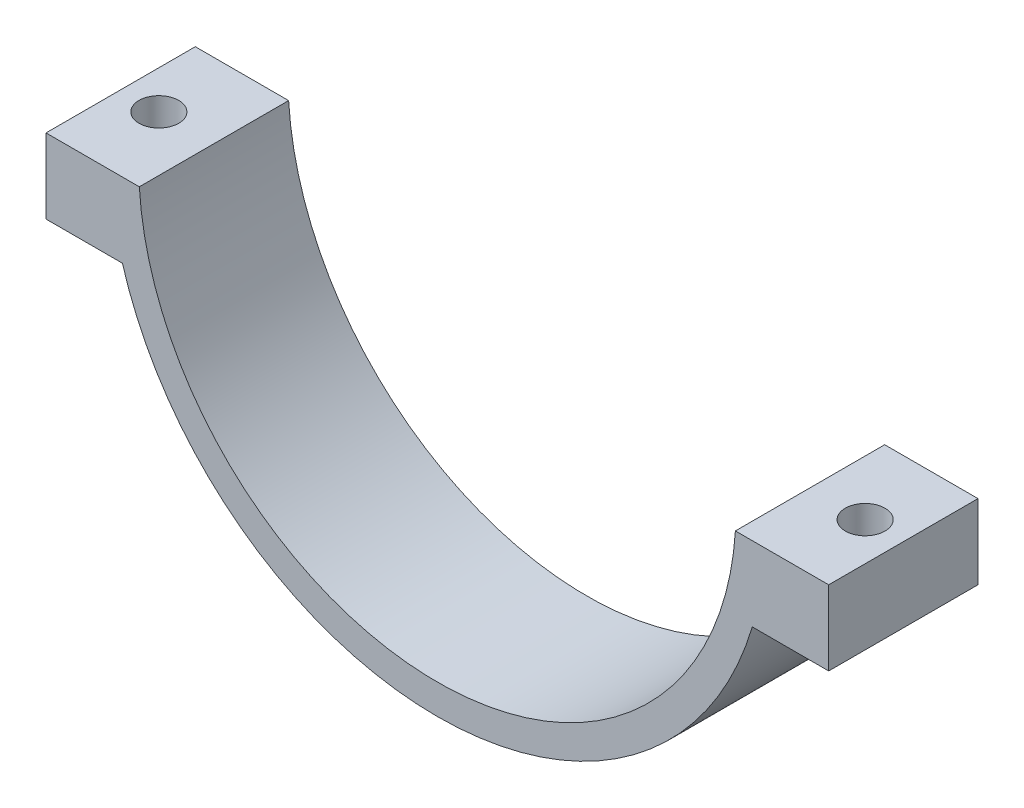
ISO-10303-21;
HEADER;
FILE_DESCRIPTION(('STEP AP214'),'2;1');
FILE_NAME('part.step','',(''),(''),'','','');
FILE_SCHEMA(('AUTOMOTIVE_DESIGN { 1 0 10303 214 1 1 1 1 }'));
ENDSEC;
DATA;
#1=APPLICATION_CONTEXT('core data for automotive mechanical design processes');
#2=APPLICATION_PROTOCOL_DEFINITION('international standard','automotive_design',2000,#1);
#3=PRODUCT_CONTEXT('',#1,'mechanical');
#4=PRODUCT('Part','Part','',(#3));
#5=PRODUCT_RELATED_PRODUCT_CATEGORY('part','',(#4));
#6=PRODUCT_DEFINITION_FORMATION('','',#4);
#7=PRODUCT_DEFINITION_CONTEXT('part definition',#1,'design');
#8=PRODUCT_DEFINITION('design','',#6,#7);
#9=PRODUCT_DEFINITION_SHAPE('','',#8);
#10=(LENGTH_UNIT() NAMED_UNIT(*) SI_UNIT(.MILLI.,.METRE.));
#11=(NAMED_UNIT(*) PLANE_ANGLE_UNIT() SI_UNIT($,.RADIAN.));
#12=(NAMED_UNIT(*) SI_UNIT($,.STERADIAN.) SOLID_ANGLE_UNIT());
#13=UNCERTAINTY_MEASURE_WITH_UNIT(LENGTH_MEASURE(1.E-05),#10,'distance_accuracy_value','');
#14=(GEOMETRIC_REPRESENTATION_CONTEXT(3) GLOBAL_UNCERTAINTY_ASSIGNED_CONTEXT((#13)) GLOBAL_UNIT_ASSIGNED_CONTEXT((#10,
#11,#12)) REPRESENTATION_CONTEXT('',''));
#15=CARTESIAN_POINT('',(0.,0.,0.));
#16=DIRECTION('',(0.,0.,1.));
#17=DIRECTION('',(1.,0.,0.));
#18=AXIS2_PLACEMENT_3D('',#15,#16,#17);
#19=CARTESIAN_POINT('',(0.,50.8,12.7));
#20=DIRECTION('',(0.,0.,-1.));
#21=DIRECTION('',(-1.,0.,0.));
#22=AXIS2_PLACEMENT_3D('',#19,#20,#21);
#23=CYLINDRICAL_SURFACE('',#22,50.8);
#24=CARTESIAN_POINT('',(0.,50.8,-12.7));
#25=DIRECTION('',(0.,0.,-1.));
#26=DIRECTION('',(1.,0.,0.));
#27=AXIS2_PLACEMENT_3D('',#24,#25,#26);
#28=CIRCLE('',#27,50.8);
#29=CARTESIAN_POINT('',(50.7006841669814,47.625,-12.7));
#30=VERTEX_POINT('',#29);
#31=CARTESIAN_POINT('',(-50.7006841669814,47.625,-12.7));
#32=VERTEX_POINT('',#31);
#33=EDGE_CURVE('E144',#30,#32,#28,.T.);
#34=ORIENTED_EDGE('',*,*,#33,.T.);
#35=DIRECTION('',(0.,0.,-1.));
#36=VECTOR('',#35,1.);
#37=CARTESIAN_POINT('',(-50.7006841669814,47.625,12.7));
#38=LINE('',#37,#36);
#39=CARTESIAN_POINT('',(-50.7006841669814,47.625,12.7));
#40=VERTEX_POINT('',#39);
#41=EDGE_CURVE('E11',#40,#32,#38,.T.);
#42=ORIENTED_EDGE('',*,*,#41,.F.);
#43=CARTESIAN_POINT('',(0.,50.8,12.7));
#44=DIRECTION('',(0.,0.,-1.));
#45=DIRECTION('',(1.,0.,0.));
#46=AXIS2_PLACEMENT_3D('',#43,#44,#45);
#47=CIRCLE('',#46,50.8);
#48=CARTESIAN_POINT('',(50.7006841669814,47.625,12.7));
#49=VERTEX_POINT('',#48);
#50=EDGE_CURVE('E167',#49,#40,#47,.T.);
#51=ORIENTED_EDGE('',*,*,#50,.F.);
#52=DIRECTION('',(0.,0.,-1.));
#53=VECTOR('',#52,1.);
#54=CARTESIAN_POINT('',(50.7006841669814,47.625,12.7));
#55=LINE('',#54,#53);
#56=EDGE_CURVE('E140',#49,#30,#55,.T.);
#57=ORIENTED_EDGE('',*,*,#56,.T.);
#58=EDGE_LOOP('',(#34,#42,#51,#57));
#59=FACE_BOUND('',#58,.T.);
#60=ADVANCED_FACE('F43',(#59),#23,.F.);
#61=CARTESIAN_POINT('',(-50.7006841669814,47.625,12.7));
#62=DIRECTION('',(0.,-1.,0.));
#63=DIRECTION('',(1.,0.,0.));
#64=AXIS2_PLACEMENT_3D('',#61,#62,#63);
#65=PLANE('',#64);
#66=CARTESIAN_POINT('',(-60.0766399988508,47.625,0.));
#67=DIRECTION('',(0.,-1.,0.));
#68=DIRECTION('',(0.,0.,-1.));
#69=AXIS2_PLACEMENT_3D('',#66,#67,#68);
#70=CIRCLE('',#69,3.3782);
#71=CARTESIAN_POINT('',(-60.0766399988508,47.625,-3.3782));
#72=VERTEX_POINT('',#71);
#73=EDGE_CURVE('E222',#72,#72,#70,.T.);
#74=ORIENTED_EDGE('',*,*,#73,.T.);
#75=EDGE_LOOP('',(#74));
#76=FACE_BOUND('',#75,.T.);
#77=DIRECTION('',(-1.,0.,0.));
#78=VECTOR('',#77,1.);
#79=CARTESIAN_POINT('',(-50.7006841669814,47.625,-12.7));
#80=LINE('',#79,#78);
#81=CARTESIAN_POINT('',(-66.5756841669814,47.625,-12.7));
#82=VERTEX_POINT('',#81);
#83=EDGE_CURVE('E148',#32,#82,#80,.T.);
#84=ORIENTED_EDGE('',*,*,#83,.T.);
#85=DIRECTION('',(0.,0.,-1.));
#86=VECTOR('',#85,1.);
#87=CARTESIAN_POINT('',(-66.5756841669814,47.625,12.7));
#88=LINE('',#87,#86);
#89=CARTESIAN_POINT('',(-66.5756841669814,47.625,12.7));
#90=VERTEX_POINT('',#89);
#91=EDGE_CURVE('E52',#90,#82,#88,.T.);
#92=ORIENTED_EDGE('',*,*,#91,.F.);
#93=DIRECTION('',(-1.,0.,0.));
#94=VECTOR('',#93,1.);
#95=CARTESIAN_POINT('',(-50.7006841669814,47.625,12.7));
#96=LINE('',#95,#94);
#97=EDGE_CURVE('E103',#40,#90,#96,.T.);
#98=ORIENTED_EDGE('',*,*,#97,.F.);
#99=ORIENTED_EDGE('',*,*,#41,.T.);
#100=EDGE_LOOP('',(#84,#92,#98,#99));
#101=FACE_BOUND('',#100,.T.);
#102=ADVANCED_FACE('F244',(#76,#101),#65,.F.);
#103=CARTESIAN_POINT('',(-66.5756841669814,47.625,12.7));
#104=DIRECTION('',(1.,0.,0.));
#105=DIRECTION('',(0.,0.,-1.));
#106=AXIS2_PLACEMENT_3D('',#103,#104,#105);
#107=PLANE('',#106);
#108=DIRECTION('',(0.,-1.,0.));
#109=VECTOR('',#108,1.);
#110=CARTESIAN_POINT('',(-66.5756841669814,47.625,-12.7));
#111=LINE('',#110,#109);
#112=CARTESIAN_POINT('',(-66.5756841669814,34.925,-12.7));
#113=VERTEX_POINT('',#112);
#114=EDGE_CURVE('E152',#82,#113,#111,.T.);
#115=ORIENTED_EDGE('',*,*,#114,.T.);
#116=DIRECTION('',(0.,0.,-1.));
#117=VECTOR('',#116,1.);
#118=CARTESIAN_POINT('',(-66.5756841669814,34.925,12.7));
#119=LINE('',#118,#117);
#120=CARTESIAN_POINT('',(-66.5756841669814,34.925,12.7));
#121=VERTEX_POINT('',#120);
#122=EDGE_CURVE('E178',#121,#113,#119,.T.);
#123=ORIENTED_EDGE('',*,*,#122,.F.);
#124=DIRECTION('',(0.,-1.,0.));
#125=VECTOR('',#124,1.);
#126=CARTESIAN_POINT('',(-66.5756841669814,47.625,12.7));
#127=LINE('',#126,#125);
#128=EDGE_CURVE('E188',#90,#121,#127,.T.);
#129=ORIENTED_EDGE('',*,*,#128,.F.);
#130=ORIENTED_EDGE('',*,*,#91,.T.);
#131=EDGE_LOOP('',(#115,#123,#129,#130));
#132=FACE_BOUND('',#131,.T.);
#133=ADVANCED_FACE('F186',(#132),#107,.F.);
#134=CARTESIAN_POINT('',(-66.5756841669814,34.925,12.7));
#135=DIRECTION('',(0.,1.,0.));
#136=DIRECTION('',(0.,0.,1.));
#137=AXIS2_PLACEMENT_3D('',#134,#135,#136);
#138=PLANE('',#137);
#139=CARTESIAN_POINT('',(-60.0766399988508,34.925,0.));
#140=DIRECTION('',(0.,-1.,0.));
#141=DIRECTION('',(0.,0.,-1.));
#142=AXIS2_PLACEMENT_3D('',#139,#140,#141);
#143=CIRCLE('',#142,4.0132);
#144=CARTESIAN_POINT('',(-60.0766399988508,34.925,-4.0132));
#145=VERTEX_POINT('',#144);
#146=EDGE_CURVE('E230',#145,#145,#143,.T.);
#147=ORIENTED_EDGE('',*,*,#146,.F.);
#148=EDGE_LOOP('',(#147));
#149=FACE_BOUND('',#148,.T.);
#150=DIRECTION('',(1.,0.,0.));
#151=VECTOR('',#150,1.);
#152=CARTESIAN_POINT('',(-66.5756841669814,34.925,-12.7));
#153=LINE('',#152,#151);
#154=CARTESIAN_POINT('',(-53.5775958307201,34.925,-12.7));
#155=VERTEX_POINT('',#154);
#156=EDGE_CURVE('E155',#113,#155,#153,.T.);
#157=ORIENTED_EDGE('',*,*,#156,.T.);
#158=DIRECTION('',(0.,0.,-1.));
#159=VECTOR('',#158,1.);
#160=CARTESIAN_POINT('',(-53.5775958307201,34.925,12.7));
#161=LINE('',#160,#159);
#162=CARTESIAN_POINT('',(-53.5775958307201,34.925,12.7));
#163=VERTEX_POINT('',#162);
#164=EDGE_CURVE('E174',#163,#155,#161,.T.);
#165=ORIENTED_EDGE('',*,*,#164,.F.);
#166=DIRECTION('',(1.,0.,0.));
#167=VECTOR('',#166,1.);
#168=CARTESIAN_POINT('',(-66.5756841669814,34.925,12.7));
#169=LINE('',#168,#167);
#170=EDGE_CURVE('E201',#121,#163,#169,.T.);
#171=ORIENTED_EDGE('',*,*,#170,.F.);
#172=ORIENTED_EDGE('',*,*,#122,.T.);
#173=EDGE_LOOP('',(#157,#165,#171,#172));
#174=FACE_BOUND('',#173,.T.);
#175=ADVANCED_FACE('F196',(#149,#174),#138,.F.);
#176=CARTESIAN_POINT('',(0.,50.8,12.7));
#177=DIRECTION('',(0.,0.,-1.));
#178=DIRECTION('',(-1.,0.,0.));
#179=AXIS2_PLACEMENT_3D('',#176,#177,#178);
#180=CYLINDRICAL_SURFACE('',#179,55.88);
#181=CARTESIAN_POINT('',(0.,50.8,-12.7));
#182=DIRECTION('',(0.,0.,1.));
#183=DIRECTION('',(1.,0.,0.));
#184=AXIS2_PLACEMENT_3D('',#181,#182,#183);
#185=CIRCLE('',#184,55.88);
#186=CARTESIAN_POINT('',(53.5775958307201,34.925,-12.7));
#187=VERTEX_POINT('',#186);
#188=EDGE_CURVE('E158',#155,#187,#185,.T.);
#189=ORIENTED_EDGE('',*,*,#188,.T.);
#190=DIRECTION('',(0.,0.,-1.));
#191=VECTOR('',#190,1.);
#192=CARTESIAN_POINT('',(53.5775958307201,34.925,12.7));
#193=LINE('',#192,#191);
#194=CARTESIAN_POINT('',(53.5775958307201,34.925,12.7));
#195=VERTEX_POINT('',#194);
#196=EDGE_CURVE('E133',#195,#187,#193,.T.);
#197=ORIENTED_EDGE('',*,*,#196,.F.);
#198=CARTESIAN_POINT('',(0.,50.8,12.7));
#199=DIRECTION('',(0.,0.,1.));
#200=DIRECTION('',(1.,0.,0.));
#201=AXIS2_PLACEMENT_3D('',#198,#199,#200);
#202=CIRCLE('',#201,55.88);
#203=EDGE_CURVE('E122',#163,#195,#202,.T.);
#204=ORIENTED_EDGE('',*,*,#203,.F.);
#205=ORIENTED_EDGE('',*,*,#164,.T.);
#206=EDGE_LOOP('',(#189,#197,#204,#205));
#207=FACE_BOUND('',#206,.T.);
#208=ADVANCED_FACE('F199',(#207),#180,.T.);
#209=CARTESIAN_POINT('',(66.5756841669814,34.925,12.7));
#210=DIRECTION('',(0.,1.,0.));
#211=DIRECTION('',(0.,0.,1.));
#212=AXIS2_PLACEMENT_3D('',#209,#210,#211);
#213=PLANE('',#212);
#214=CARTESIAN_POINT('',(60.0766399988508,34.925,0.));
#215=DIRECTION('',(0.,-1.,0.));
#216=DIRECTION('',(0.,0.,-1.));
#217=AXIS2_PLACEMENT_3D('',#214,#215,#216);
#218=CIRCLE('',#217,4.01319999999999);
#219=CARTESIAN_POINT('',(60.0766399988508,34.925,-4.0132));
#220=VERTEX_POINT('',#219);
#221=EDGE_CURVE('E218',#220,#220,#218,.T.);
#222=ORIENTED_EDGE('',*,*,#221,.F.);
#223=EDGE_LOOP('',(#222));
#224=FACE_BOUND('',#223,.T.);
#225=DIRECTION('',(1.,0.,0.));
#226=VECTOR('',#225,1.);
#227=CARTESIAN_POINT('',(66.5756841669814,34.925,-12.7));
#228=LINE('',#227,#226);
#229=CARTESIAN_POINT('',(66.5756841669814,34.925,-12.7));
#230=VERTEX_POINT('',#229);
#231=EDGE_CURVE('E131',#187,#230,#228,.T.);
#232=ORIENTED_EDGE('',*,*,#231,.T.);
#233=DIRECTION('',(0.,0.,-1.));
#234=VECTOR('',#233,1.);
#235=CARTESIAN_POINT('',(66.5756841669814,34.925,12.7));
#236=LINE('',#235,#234);
#237=CARTESIAN_POINT('',(66.5756841669814,34.925,12.7));
#238=VERTEX_POINT('',#237);
#239=EDGE_CURVE('E128',#238,#230,#236,.T.);
#240=ORIENTED_EDGE('',*,*,#239,.F.);
#241=DIRECTION('',(1.,0.,0.));
#242=VECTOR('',#241,1.);
#243=CARTESIAN_POINT('',(66.5756841669814,34.925,12.7));
#244=LINE('',#243,#242);
#245=EDGE_CURVE('E116',#195,#238,#244,.T.);
#246=ORIENTED_EDGE('',*,*,#245,.F.);
#247=ORIENTED_EDGE('',*,*,#196,.T.);
#248=EDGE_LOOP('',(#232,#240,#246,#247));
#249=FACE_BOUND('',#248,.T.);
#250=ADVANCED_FACE('F129',(#224,#249),#213,.F.);
#251=CARTESIAN_POINT('',(66.5756841669814,47.625,12.7));
#252=DIRECTION('',(-1.,0.,0.));
#253=DIRECTION('',(0.,0.,1.));
#254=AXIS2_PLACEMENT_3D('',#251,#252,#253);
#255=PLANE('',#254);
#256=DIRECTION('',(0.,1.,0.));
#257=VECTOR('',#256,1.);
#258=CARTESIAN_POINT('',(66.5756841669814,47.625,-12.7));
#259=LINE('',#258,#257);
#260=CARTESIAN_POINT('',(66.5756841669814,47.625,-12.7));
#261=VERTEX_POINT('',#260);
#262=EDGE_CURVE('E89',#230,#261,#259,.T.);
#263=ORIENTED_EDGE('',*,*,#262,.T.);
#264=DIRECTION('',(0.,0.,-1.));
#265=VECTOR('',#264,1.);
#266=CARTESIAN_POINT('',(66.5756841669814,47.625,12.7));
#267=LINE('',#266,#265);
#268=CARTESIAN_POINT('',(66.5756841669814,47.625,12.7));
#269=VERTEX_POINT('',#268);
#270=EDGE_CURVE('E134',#269,#261,#267,.T.);
#271=ORIENTED_EDGE('',*,*,#270,.F.);
#272=DIRECTION('',(0.,1.,0.));
#273=VECTOR('',#272,1.);
#274=CARTESIAN_POINT('',(66.5756841669814,47.625,12.7));
#275=LINE('',#274,#273);
#276=EDGE_CURVE('E120',#238,#269,#275,.T.);
#277=ORIENTED_EDGE('',*,*,#276,.F.);
#278=ORIENTED_EDGE('',*,*,#239,.T.);
#279=EDGE_LOOP('',(#263,#271,#277,#278));
#280=FACE_BOUND('',#279,.T.);
#281=ADVANCED_FACE('F136',(#280),#255,.F.);
#282=CARTESIAN_POINT('',(50.7006841669814,47.625,12.7));
#283=DIRECTION('',(0.,-1.,0.));
#284=DIRECTION('',(1.,0.,0.));
#285=AXIS2_PLACEMENT_3D('',#282,#283,#284);
#286=PLANE('',#285);
#287=CARTESIAN_POINT('',(60.0766399988508,47.625,0.));
#288=DIRECTION('',(0.,-1.,0.));
#289=DIRECTION('',(0.,0.,-1.));
#290=AXIS2_PLACEMENT_3D('',#287,#288,#289);
#291=CIRCLE('',#290,3.3782);
#292=CARTESIAN_POINT('',(60.0766399988508,47.625,-3.3782));
#293=VERTEX_POINT('',#292);
#294=EDGE_CURVE('E149',#293,#293,#291,.T.);
#295=ORIENTED_EDGE('',*,*,#294,.T.);
#296=EDGE_LOOP('',(#295));
#297=FACE_BOUND('',#296,.T.);
#298=DIRECTION('',(-1.,0.,0.));
#299=VECTOR('',#298,1.);
#300=CARTESIAN_POINT('',(50.7006841669814,47.625,-12.7));
#301=LINE('',#300,#299);
#302=EDGE_CURVE('E95',#261,#30,#301,.T.);
#303=ORIENTED_EDGE('',*,*,#302,.T.);
#304=ORIENTED_EDGE('',*,*,#56,.F.);
#305=DIRECTION('',(-1.,0.,0.));
#306=VECTOR('',#305,1.);
#307=CARTESIAN_POINT('',(50.7006841669814,47.625,12.7));
#308=LINE('',#307,#306);
#309=EDGE_CURVE('E60',#269,#49,#308,.T.);
#310=ORIENTED_EDGE('',*,*,#309,.F.);
#311=ORIENTED_EDGE('',*,*,#270,.T.);
#312=EDGE_LOOP('',(#303,#304,#310,#311));
#313=FACE_BOUND('',#312,.T.);
#314=ADVANCED_FACE('F254',(#297,#313),#286,.F.);
#315=CARTESIAN_POINT('',(0.,50.8,12.7));
#316=DIRECTION('',(0.,0.,1.));
#317=DIRECTION('',(1.,0.,0.));
#318=AXIS2_PLACEMENT_3D('',#315,#316,#317);
#319=PLANE('',#318);
#320=ORIENTED_EDGE('',*,*,#50,.T.);
#321=ORIENTED_EDGE('',*,*,#97,.T.);
#322=ORIENTED_EDGE('',*,*,#128,.T.);
#323=ORIENTED_EDGE('',*,*,#170,.T.);
#324=ORIENTED_EDGE('',*,*,#203,.T.);
#325=ORIENTED_EDGE('',*,*,#245,.T.);
#326=ORIENTED_EDGE('',*,*,#276,.T.);
#327=ORIENTED_EDGE('',*,*,#309,.T.);
#328=EDGE_LOOP('',(#320,#321,#322,#323,#324,#325,#326,#327));
#329=FACE_BOUND('',#328,.T.);
#330=ADVANCED_FACE('F118',(#329),#319,.T.);
#331=CARTESIAN_POINT('',(0.,50.8,-12.7));
#332=DIRECTION('',(0.,0.,1.));
#333=DIRECTION('',(1.,0.,0.));
#334=AXIS2_PLACEMENT_3D('',#331,#332,#333);
#335=PLANE('',#334);
#336=ORIENTED_EDGE('',*,*,#33,.F.);
#337=ORIENTED_EDGE('',*,*,#302,.F.);
#338=ORIENTED_EDGE('',*,*,#262,.F.);
#339=ORIENTED_EDGE('',*,*,#231,.F.);
#340=ORIENTED_EDGE('',*,*,#188,.F.);
#341=ORIENTED_EDGE('',*,*,#156,.F.);
#342=ORIENTED_EDGE('',*,*,#114,.F.);
#343=ORIENTED_EDGE('',*,*,#83,.F.);
#344=EDGE_LOOP('',(#336,#337,#338,#339,#340,#341,#342,#343));
#345=FACE_BOUND('',#344,.T.);
#346=ADVANCED_FACE('F192',(#345),#335,.F.);
#347=CARTESIAN_POINT('',(60.0766399988508,34.925,0.));
#348=DIRECTION('',(0.,-1.,0.));
#349=DIRECTION('',(0.,0.,-1.));
#350=AXIS2_PLACEMENT_3D('',#347,#348,#349);
#351=CYLINDRICAL_SURFACE('',#350,3.3782);
#352=ORIENTED_EDGE('',*,*,#294,.F.);
#353=EDGE_LOOP('',(#352));
#354=FACE_BOUND('',#353,.T.);
#355=CARTESIAN_POINT('',(60.0766399988508,35.56,0.));
#356=DIRECTION('',(0.,-1.,0.));
#357=DIRECTION('',(0.,0.,-1.));
#358=AXIS2_PLACEMENT_3D('',#355,#356,#357);
#359=CIRCLE('',#358,3.3782);
#360=CARTESIAN_POINT('',(60.0766399988508,35.56,-3.3782));
#361=VERTEX_POINT('',#360);
#362=EDGE_CURVE('E214',#361,#361,#359,.T.);
#363=ORIENTED_EDGE('',*,*,#362,.T.);
#364=EDGE_LOOP('',(#363));
#365=FACE_BOUND('',#364,.T.);
#366=ADVANCED_FACE('F275',(#354,#365),#351,.F.);
#367=CARTESIAN_POINT('',(60.0766399988508,34.925,0.));
#368=DIRECTION('',(0.,-1.,0.));
#369=DIRECTION('',(0.,0.,-1.));
#370=AXIS2_PLACEMENT_3D('',#367,#368,#369);
#371=CONICAL_SURFACE('',#370,4.01319999999999,0.785398163397443);
#372=ORIENTED_EDGE('',*,*,#362,.F.);
#373=EDGE_LOOP('',(#372));
#374=FACE_BOUND('',#373,.T.);
#375=ORIENTED_EDGE('',*,*,#221,.T.);
#376=EDGE_LOOP('',(#375));
#377=FACE_BOUND('',#376,.T.);
#378=ADVANCED_FACE('F272',(#374,#377),#371,.F.);
#379=CARTESIAN_POINT('',(-60.0766399988508,34.925,0.));
#380=DIRECTION('',(0.,-1.,0.));
#381=DIRECTION('',(0.,0.,-1.));
#382=AXIS2_PLACEMENT_3D('',#379,#380,#381);
#383=CYLINDRICAL_SURFACE('',#382,3.3782);
#384=ORIENTED_EDGE('',*,*,#73,.F.);
#385=EDGE_LOOP('',(#384));
#386=FACE_BOUND('',#385,.T.);
#387=CARTESIAN_POINT('',(-60.0766399988508,35.56,0.));
#388=DIRECTION('',(0.,-1.,0.));
#389=DIRECTION('',(0.,0.,-1.));
#390=AXIS2_PLACEMENT_3D('',#387,#388,#389);
#391=CIRCLE('',#390,3.3782);
#392=CARTESIAN_POINT('',(-60.0766399988508,35.56,-3.3782));
#393=VERTEX_POINT('',#392);
#394=EDGE_CURVE('E226',#393,#393,#391,.T.);
#395=ORIENTED_EDGE('',*,*,#394,.T.);
#396=EDGE_LOOP('',(#395));
#397=FACE_BOUND('',#396,.T.);
#398=ADVANCED_FACE('F274',(#386,#397),#383,.F.);
#399=CARTESIAN_POINT('',(-60.0766399988508,34.925,0.));
#400=DIRECTION('',(0.,-1.,0.));
#401=DIRECTION('',(0.,0.,-1.));
#402=AXIS2_PLACEMENT_3D('',#399,#400,#401);
#403=CONICAL_SURFACE('',#402,4.0132,0.785398163397448);
#404=ORIENTED_EDGE('',*,*,#394,.F.);
#405=EDGE_LOOP('',(#404));
#406=FACE_BOUND('',#405,.T.);
#407=ORIENTED_EDGE('',*,*,#146,.T.);
#408=EDGE_LOOP('',(#407));
#409=FACE_BOUND('',#408,.T.);
#410=ADVANCED_FACE('F235',(#406,#409),#403,.F.);
#411=CLOSED_SHELL('',(#60,#102,#133,#175,#208,#250,#281,#314,#330,#346,#366,#378,#398,#410));
#412=MANIFOLD_SOLID_BREP('B2',#411);
#413=ADVANCED_BREP_SHAPE_REPRESENTATION('',(#18,#412),#14);
#414=SHAPE_DEFINITION_REPRESENTATION(#9,#413);
ENDSEC;
END-ISO-10303-21;
